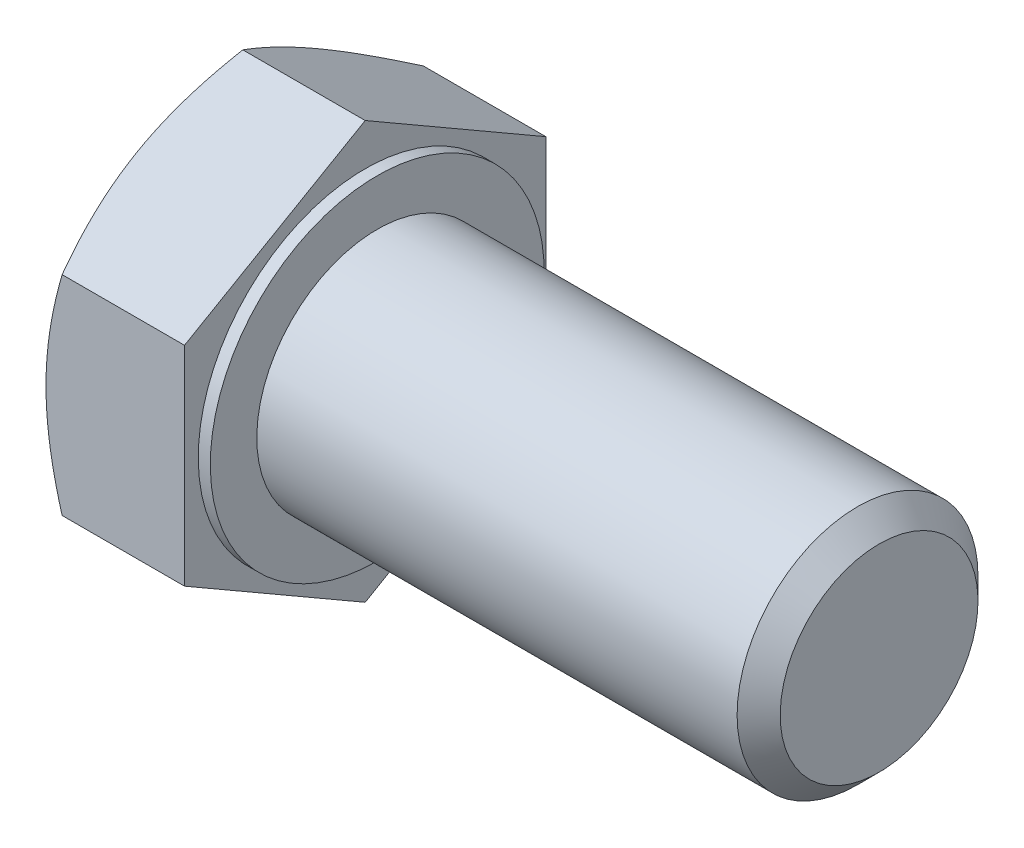
ISO-10303-21;
HEADER;
FILE_DESCRIPTION(('STEP AP214'),'2;1');
FILE_NAME('part.step','',(''),(''),'','','');
FILE_SCHEMA(('AUTOMOTIVE_DESIGN { 1 0 10303 214 1 1 1 1 }'));
ENDSEC;
DATA;
#1=APPLICATION_CONTEXT('core data for automotive mechanical design processes');
#2=APPLICATION_PROTOCOL_DEFINITION('international standard','automotive_design',2000,#1);
#3=PRODUCT_CONTEXT('',#1,'mechanical');
#4=PRODUCT('Part','Part','',(#3));
#5=PRODUCT_RELATED_PRODUCT_CATEGORY('part','',(#4));
#6=PRODUCT_DEFINITION_FORMATION('','',#4);
#7=PRODUCT_DEFINITION_CONTEXT('part definition',#1,'design');
#8=PRODUCT_DEFINITION('design','',#6,#7);
#9=PRODUCT_DEFINITION_SHAPE('','',#8);
#10=(LENGTH_UNIT() NAMED_UNIT(*) SI_UNIT(.MILLI.,.METRE.));
#11=(NAMED_UNIT(*) PLANE_ANGLE_UNIT() SI_UNIT($,.RADIAN.));
#12=(NAMED_UNIT(*) SI_UNIT($,.STERADIAN.) SOLID_ANGLE_UNIT());
#13=UNCERTAINTY_MEASURE_WITH_UNIT(LENGTH_MEASURE(1.E-05),#10,'distance_accuracy_value','');
#14=(GEOMETRIC_REPRESENTATION_CONTEXT(3) GLOBAL_UNCERTAINTY_ASSIGNED_CONTEXT((#13)) GLOBAL_UNIT_ASSIGNED_CONTEXT((#10,
#11,#12)) REPRESENTATION_CONTEXT('',''));
#15=CARTESIAN_POINT('',(0.,0.,0.));
#16=DIRECTION('',(0.,0.,1.));
#17=DIRECTION('',(1.,0.,0.));
#18=AXIS2_PLACEMENT_3D('',#15,#16,#17);
#19=CARTESIAN_POINT('',(0.,7.1575,0.));
#20=DIRECTION('',(1.,0.,0.));
#21=DIRECTION('',(0.,1.,0.));
#22=AXIS2_PLACEMENT_3D('',#19,#20,#21);
#23=PLANE('',#22);
#24=CARTESIAN_POINT('',(0.,0.,0.));
#25=DIRECTION('',(1.,0.,0.));
#26=DIRECTION('',(0.,1.,0.));
#27=AXIS2_PLACEMENT_3D('',#24,#25,#26);
#28=CIRCLE('',#27,6.);
#29=CARTESIAN_POINT('',(0.,-6.,0.));
#30=VERTEX_POINT('',#29);
#31=EDGE_CURVE('E147',#30,#30,#28,.T.);
#32=ORIENTED_EDGE('',*,*,#31,.F.);
#33=EDGE_LOOP('',(#32));
#34=FACE_BOUND('',#33,.T.);
#35=CARTESIAN_POINT('',(0.,0.,0.));
#36=DIRECTION('',(1.,0.,0.));
#37=DIRECTION('',(0.,1.,0.));
#38=AXIS2_PLACEMENT_3D('',#35,#36,#37);
#39=CIRCLE('',#38,8.315);
#40=CARTESIAN_POINT('',(0.,-8.315,0.));
#41=VERTEX_POINT('',#40);
#42=EDGE_CURVE('E30',#41,#41,#39,.T.);
#43=ORIENTED_EDGE('',*,*,#42,.T.);
#44=EDGE_LOOP('',(#43));
#45=FACE_BOUND('',#44,.T.);
#46=ADVANCED_FACE('F17',(#34,#45),#23,.T.);
#47=CARTESIAN_POINT('',(-0.300049999999996,0.,0.));
#48=DIRECTION('',(1.,0.,0.));
#49=DIRECTION('',(0.,1.,0.));
#50=AXIS2_PLACEMENT_3D('',#47,#48,#49);
#51=CYLINDRICAL_SURFACE('',#50,8.315);
#52=ORIENTED_EDGE('',*,*,#42,.F.);
#53=DIRECTION('',(-1.,0.,0.));
#54=VECTOR('',#53,1.);
#55=CARTESIAN_POINT('',(-0.300049999999996,-8.315,0.));
#56=LINE('',#55,#54);
#57=CARTESIAN_POINT('',(-0.6001,-8.315,0.));
#58=VERTEX_POINT('',#57);
#59=EDGE_CURVE('E11',#41,#58,#56,.T.);
#60=ORIENTED_EDGE('',*,*,#59,.T.);
#61=CARTESIAN_POINT('',(-0.6001,0.,0.));
#62=DIRECTION('',(1.,0.,0.));
#63=DIRECTION('',(0.,1.,0.));
#64=AXIS2_PLACEMENT_3D('',#61,#62,#63);
#65=CIRCLE('',#64,8.315);
#66=EDGE_CURVE('E227',#58,#58,#65,.T.);
#67=ORIENTED_EDGE('',*,*,#66,.T.);
#68=ORIENTED_EDGE('',*,*,#59,.F.);
#69=EDGE_LOOP('',(#52,#60,#67,#68));
#70=FACE_BOUND('',#69,.T.);
#71=ADVANCED_FACE('F427',(#70),#51,.T.);
#72=CARTESIAN_POINT('',(-7.5001,0.,0.));
#73=DIRECTION('',(1.,0.,0.));
#74=DIRECTION('',(0.,1.,0.));
#75=AXIS2_PLACEMENT_3D('',#72,#73,#74);
#76=PLANE('',#75);
#77=CARTESIAN_POINT('',(-7.5001,0.,0.));
#78=DIRECTION('',(-1.,0.,0.));
#79=DIRECTION('',(0.,1.,0.));
#80=AXIS2_PLACEMENT_3D('',#77,#78,#79);
#81=CIRCLE('',#80,9.);
#82=CARTESIAN_POINT('',(-7.5001,0.,9.));
#83=VERTEX_POINT('',#82);
#84=CARTESIAN_POINT('',(-7.5001,7.79422863405994,4.5));
#85=VERTEX_POINT('',#84);
#86=EDGE_CURVE('E161',#83,#85,#81,.T.);
#87=ORIENTED_EDGE('',*,*,#86,.T.);
#88=CARTESIAN_POINT('',(-7.5001,0.,0.));
#89=DIRECTION('',(-1.,0.,0.));
#90=DIRECTION('',(0.,1.,0.));
#91=AXIS2_PLACEMENT_3D('',#88,#89,#90);
#92=CIRCLE('',#91,9.);
#93=CARTESIAN_POINT('',(-7.5001,7.79422863405994,-4.5));
#94=VERTEX_POINT('',#93);
#95=EDGE_CURVE('E184',#85,#94,#92,.T.);
#96=ORIENTED_EDGE('',*,*,#95,.T.);
#97=CARTESIAN_POINT('',(-7.5001,0.,0.));
#98=DIRECTION('',(-1.,0.,0.));
#99=DIRECTION('',(0.,1.,0.));
#100=AXIS2_PLACEMENT_3D('',#97,#98,#99);
#101=CIRCLE('',#100,9.);
#102=CARTESIAN_POINT('',(-7.5001,0.,-9.));
#103=VERTEX_POINT('',#102);
#104=EDGE_CURVE('E274',#94,#103,#101,.T.);
#105=ORIENTED_EDGE('',*,*,#104,.T.);
#106=CARTESIAN_POINT('',(-7.5001,0.,0.));
#107=DIRECTION('',(-1.,0.,0.));
#108=DIRECTION('',(0.,1.,0.));
#109=AXIS2_PLACEMENT_3D('',#106,#107,#108);
#110=CIRCLE('',#109,9.);
#111=CARTESIAN_POINT('',(-7.5001,-7.79422863405994,-4.5));
#112=VERTEX_POINT('',#111);
#113=EDGE_CURVE('E166',#103,#112,#110,.T.);
#114=ORIENTED_EDGE('',*,*,#113,.T.);
#115=CARTESIAN_POINT('',(-7.5001,0.,0.));
#116=DIRECTION('',(-1.,0.,0.));
#117=DIRECTION('',(0.,1.,0.));
#118=AXIS2_PLACEMENT_3D('',#115,#116,#117);
#119=CIRCLE('',#118,9.);
#120=CARTESIAN_POINT('',(-7.5001,-7.79422863405994,4.5));
#121=VERTEX_POINT('',#120);
#122=EDGE_CURVE('E168',#112,#121,#119,.T.);
#123=ORIENTED_EDGE('',*,*,#122,.T.);
#124=CARTESIAN_POINT('',(-7.5001,0.,0.));
#125=DIRECTION('',(-1.,0.,0.));
#126=DIRECTION('',(0.,1.,0.));
#127=AXIS2_PLACEMENT_3D('',#124,#125,#126);
#128=CIRCLE('',#127,9.);
#129=EDGE_CURVE('E185',#121,#83,#128,.T.);
#130=ORIENTED_EDGE('',*,*,#129,.T.);
#131=EDGE_LOOP('',(#87,#96,#105,#114,#123,#130));
#132=FACE_BOUND('',#131,.T.);
#133=ADVANCED_FACE('F319',(#132),#76,.F.);
#134=CARTESIAN_POINT('',(-0.600099999999993,-10.3923048454133,0.));
#135=DIRECTION('',(0.,-0.866025403784438,-0.5));
#136=DIRECTION('',(0.,0.5,-0.866025403784438));
#137=AXIS2_PLACEMENT_3D('',#134,#135,#136);
#138=PLANE('',#137);
#139=CARTESIAN_POINT('',(-7.5001,-7.79422863405994,-4.5));
#140=CARTESIAN_POINT('',(-7.50010000000001,-6.58845726811989,-6.58845726811988));
#141=CARTESIAN_POINT('',(-6.69625242270666,-5.19615242270663,-9.));
#142=(BOUNDED_CURVE() B_SPLINE_CURVE(2,(#139,#140,#141),.UNSPECIFIED.,.F.,
.F.) B_SPLINE_CURVE_WITH_KNOTS((3,3),(0.527138746897715,1.05427749379543),
.UNSPECIFIED.) CURVE() GEOMETRIC_REPRESENTATION_ITEM() RATIONAL_B_SPLINE_CURVE((1.,
1.03795484930204,1.)) REPRESENTATION_ITEM(''));
#143=CARTESIAN_POINT('',(-6.69625242270666,-5.19615242270664,-9.));
#144=VERTEX_POINT('',#143);
#145=EDGE_CURVE('E202',#112,#144,#142,.T.);
#146=ORIENTED_EDGE('',*,*,#145,.T.);
#147=DIRECTION('',(-1.,0.,0.));
#148=VECTOR('',#147,1.);
#149=CARTESIAN_POINT('',(-0.600099999999993,-5.19615242270662,-9.));
#150=LINE('',#149,#148);
#151=CARTESIAN_POINT('',(-0.600099999999993,-5.19615242270662,-9.));
#152=VERTEX_POINT('',#151);
#153=EDGE_CURVE('E173',#152,#144,#150,.T.);
#154=ORIENTED_EDGE('',*,*,#153,.F.);
#155=DIRECTION('',(0.,0.5,-0.866025403784438));
#156=VECTOR('',#155,1.);
#157=CARTESIAN_POINT('',(-0.600099999999993,-10.3923048454133,0.));
#158=LINE('',#157,#156);
#159=CARTESIAN_POINT('',(-0.600099999999993,-10.3923048454133,0.));
#160=VERTEX_POINT('',#159);
#161=EDGE_CURVE('E138',#160,#152,#158,.T.);
#162=ORIENTED_EDGE('',*,*,#161,.F.);
#163=DIRECTION('',(-1.,0.,0.));
#164=VECTOR('',#163,1.);
#165=CARTESIAN_POINT('',(-0.600099999999993,-10.3923048454133,0.));
#166=LINE('',#165,#164);
#167=CARTESIAN_POINT('',(-6.69625242270666,-10.3923048454132,0.));
#168=VERTEX_POINT('',#167);
#169=EDGE_CURVE('E226',#160,#168,#166,.T.);
#170=ORIENTED_EDGE('',*,*,#169,.T.);
#171=CARTESIAN_POINT('',(-6.69625242270666,-10.3923048454132,0.));
#172=CARTESIAN_POINT('',(-7.50010000000001,-8.99999999999998,-2.41154273188012));
#173=CARTESIAN_POINT('',(-7.5001,-7.79422863405994,-4.5));
#174=(BOUNDED_CURVE() B_SPLINE_CURVE(2,(#171,#172,#173),.UNSPECIFIED.,.F.,
.F.) B_SPLINE_CURVE_WITH_KNOTS((3,3),(0.,0.527138746897715),
.UNSPECIFIED.) CURVE() GEOMETRIC_REPRESENTATION_ITEM() RATIONAL_B_SPLINE_CURVE((1.,
1.03795484930204,1.)) REPRESENTATION_ITEM(''));
#175=EDGE_CURVE('E194',#168,#112,#174,.T.);
#176=ORIENTED_EDGE('',*,*,#175,.T.);
#177=EDGE_LOOP('',(#146,#154,#162,#170,#176));
#178=FACE_BOUND('',#177,.T.);
#179=ADVANCED_FACE('F373',(#178),#138,.T.);
#180=CARTESIAN_POINT('',(-0.600099999999993,-5.19615242270663,9.));
#181=DIRECTION('',(0.,-0.866025403784439,0.5));
#182=DIRECTION('',(-1.,0.,0.));
#183=AXIS2_PLACEMENT_3D('',#180,#181,#182);
#184=PLANE('',#183);
#185=CARTESIAN_POINT('',(-7.5001,-7.79422863405994,4.5));
#186=CARTESIAN_POINT('',(-7.50010000000002,-8.99999999999999,2.4115427318801));
#187=CARTESIAN_POINT('',(-6.69625242270666,-10.3923048454132,0.));
#188=(BOUNDED_CURVE() B_SPLINE_CURVE(2,(#185,#186,#187),.UNSPECIFIED.,.F.,
.F.) B_SPLINE_CURVE_WITH_KNOTS((3,3),(0.527138746897716,1.05427749379543),
.UNSPECIFIED.) CURVE() GEOMETRIC_REPRESENTATION_ITEM() RATIONAL_B_SPLINE_CURVE((1.,
1.03795484930203,1.)) REPRESENTATION_ITEM(''));
#189=EDGE_CURVE('E172',#121,#168,#188,.T.);
#190=ORIENTED_EDGE('',*,*,#189,.T.);
#191=ORIENTED_EDGE('',*,*,#169,.F.);
#192=DIRECTION('',(0.,-0.5,-0.866025403784439));
#193=VECTOR('',#192,1.);
#194=CARTESIAN_POINT('',(-0.600099999999993,-5.19615242270663,9.));
#195=LINE('',#194,#193);
#196=CARTESIAN_POINT('',(-0.600099999999993,-5.19615242270663,9.));
#197=VERTEX_POINT('',#196);
#198=EDGE_CURVE('E287',#197,#160,#195,.T.);
#199=ORIENTED_EDGE('',*,*,#198,.F.);
#200=DIRECTION('',(-1.,0.,0.));
#201=VECTOR('',#200,1.);
#202=CARTESIAN_POINT('',(-0.600099999999993,-5.19615242270663,9.));
#203=LINE('',#202,#201);
#204=CARTESIAN_POINT('',(-6.69625242270666,-5.1961524227066,9.));
#205=VERTEX_POINT('',#204);
#206=EDGE_CURVE('E223',#197,#205,#203,.T.);
#207=ORIENTED_EDGE('',*,*,#206,.T.);
#208=CARTESIAN_POINT('',(-6.69625242270666,-5.19615242270665,9.));
#209=CARTESIAN_POINT('',(-7.50010000000001,-6.5884572681199,6.58845726811989));
#210=CARTESIAN_POINT('',(-7.5001,-7.79422863405994,4.5));
#211=(BOUNDED_CURVE() B_SPLINE_CURVE(2,(#208,#209,#210),.UNSPECIFIED.,.F.,
.F.) B_SPLINE_CURVE_WITH_KNOTS((3,3),(0.,0.527138746897716),
.UNSPECIFIED.) CURVE() GEOMETRIC_REPRESENTATION_ITEM() RATIONAL_B_SPLINE_CURVE((1.,
1.03795484930204,1.)) REPRESENTATION_ITEM(''));
#212=EDGE_CURVE('E246',#205,#121,#211,.T.);
#213=ORIENTED_EDGE('',*,*,#212,.T.);
#214=EDGE_LOOP('',(#190,#191,#199,#207,#213));
#215=FACE_BOUND('',#214,.T.);
#216=ADVANCED_FACE('F379',(#215),#184,.T.);
#217=CARTESIAN_POINT('',(-0.6001,5.19615242270662,9.));
#218=DIRECTION('',(0.,0.,1.));
#219=DIRECTION('',(1.,0.,0.));
#220=AXIS2_PLACEMENT_3D('',#217,#218,#219);
#221=PLANE('',#220);
#222=CARTESIAN_POINT('',(-7.5001,0.,9.));
#223=CARTESIAN_POINT('',(-7.50010000000003,-2.41154273188009,8.99999999999999));
#224=CARTESIAN_POINT('',(-6.69625242270666,-5.19615242270661,9.));
#225=(BOUNDED_CURVE() B_SPLINE_CURVE(2,(#222,#223,#224),.UNSPECIFIED.,.F.,
.F.) B_SPLINE_CURVE_WITH_KNOTS((3,3),(0.527138746897716,1.05427749379543),
.UNSPECIFIED.) CURVE() GEOMETRIC_REPRESENTATION_ITEM() RATIONAL_B_SPLINE_CURVE((1.,
1.03795484930205,1.)) REPRESENTATION_ITEM(''));
#226=EDGE_CURVE('E252',#83,#205,#225,.T.);
#227=ORIENTED_EDGE('',*,*,#226,.T.);
#228=ORIENTED_EDGE('',*,*,#206,.F.);
#229=DIRECTION('',(0.,-1.,0.));
#230=VECTOR('',#229,1.);
#231=CARTESIAN_POINT('',(-0.6001,5.19615242270662,9.));
#232=LINE('',#231,#230);
#233=CARTESIAN_POINT('',(-0.6001,5.19615242270662,9.));
#234=VERTEX_POINT('',#233);
#235=EDGE_CURVE('E219',#234,#197,#232,.T.);
#236=ORIENTED_EDGE('',*,*,#235,.F.);
#237=DIRECTION('',(-1.,0.,0.));
#238=VECTOR('',#237,1.);
#239=CARTESIAN_POINT('',(-0.6001,5.19615242270662,9.));
#240=LINE('',#239,#238);
#241=CARTESIAN_POINT('',(-6.69625242270666,5.19615242270659,9.));
#242=VERTEX_POINT('',#241);
#243=EDGE_CURVE('E201',#234,#242,#240,.T.);
#244=ORIENTED_EDGE('',*,*,#243,.T.);
#245=CARTESIAN_POINT('',(-6.69625242270666,5.1961524227066,9.));
#246=CARTESIAN_POINT('',(-7.50010000000001,2.41154273188008,9.));
#247=CARTESIAN_POINT('',(-7.5001,0.,9.));
#248=(BOUNDED_CURVE() B_SPLINE_CURVE(2,(#245,#246,#247),.UNSPECIFIED.,.F.,
.F.) B_SPLINE_CURVE_WITH_KNOTS((3,3),(0.,0.527138746897716),
.UNSPECIFIED.) CURVE() GEOMETRIC_REPRESENTATION_ITEM() RATIONAL_B_SPLINE_CURVE((1.,
1.03795484930204,1.)) REPRESENTATION_ITEM(''));
#249=EDGE_CURVE('E253',#242,#83,#248,.T.);
#250=ORIENTED_EDGE('',*,*,#249,.T.);
#251=EDGE_LOOP('',(#227,#228,#236,#244,#250));
#252=FACE_BOUND('',#251,.T.);
#253=ADVANCED_FACE('F453',(#252),#221,.T.);
#254=CARTESIAN_POINT('',(-0.6001,0.,0.));
#255=DIRECTION('',(1.,0.,0.));
#256=DIRECTION('',(0.,1.,0.));
#257=AXIS2_PLACEMENT_3D('',#254,#255,#256);
#258=PLANE('',#257);
#259=ORIENTED_EDGE('',*,*,#66,.F.);
#260=EDGE_LOOP('',(#259));
#261=FACE_BOUND('',#260,.T.);
#262=DIRECTION('',(0.,-0.5,0.866025403784438));
#263=VECTOR('',#262,1.);
#264=CARTESIAN_POINT('',(-0.6001,10.3923048454133,0.));
#265=LINE('',#264,#263);
#266=CARTESIAN_POINT('',(-0.6001,10.3923048454133,0.));
#267=VERTEX_POINT('',#266);
#268=EDGE_CURVE('E127',#267,#234,#265,.T.);
#269=ORIENTED_EDGE('',*,*,#268,.T.);
#270=ORIENTED_EDGE('',*,*,#235,.T.);
#271=ORIENTED_EDGE('',*,*,#198,.T.);
#272=ORIENTED_EDGE('',*,*,#161,.T.);
#273=DIRECTION('',(0.,1.,0.));
#274=VECTOR('',#273,1.);
#275=CARTESIAN_POINT('',(-0.600099999999993,-5.19615242270662,-9.));
#276=LINE('',#275,#274);
#277=CARTESIAN_POINT('',(-0.6001,5.19615242270663,-9.));
#278=VERTEX_POINT('',#277);
#279=EDGE_CURVE('E177',#152,#278,#276,.T.);
#280=ORIENTED_EDGE('',*,*,#279,.T.);
#281=DIRECTION('',(0.,0.5,0.866025403784439));
#282=VECTOR('',#281,1.);
#283=CARTESIAN_POINT('',(-0.6001,5.19615242270663,-9.));
#284=LINE('',#283,#282);
#285=EDGE_CURVE('E195',#278,#267,#284,.T.);
#286=ORIENTED_EDGE('',*,*,#285,.T.);
#287=EDGE_LOOP('',(#269,#270,#271,#272,#280,#286));
#288=FACE_BOUND('',#287,.T.);
#289=ADVANCED_FACE('F447',(#261,#288),#258,.T.);
#290=CARTESIAN_POINT('',(-0.6001,10.3923048454133,0.));
#291=DIRECTION('',(0.,0.866025403784438,0.5));
#292=DIRECTION('',(1.,0.,0.));
#293=AXIS2_PLACEMENT_3D('',#290,#291,#292);
#294=PLANE('',#293);
#295=CARTESIAN_POINT('',(-6.69625242270666,10.3923048454132,0.));
#296=CARTESIAN_POINT('',(-7.50010000000002,8.99999999999999,2.41154273188012));
#297=CARTESIAN_POINT('',(-7.5001,7.79422863405994,4.5));
#298=(BOUNDED_CURVE() B_SPLINE_CURVE(2,(#295,#296,#297),.UNSPECIFIED.,.F.,
.F.) B_SPLINE_CURVE_WITH_KNOTS((3,3),(0.,0.527138746897715),
.UNSPECIFIED.) CURVE() GEOMETRIC_REPRESENTATION_ITEM() RATIONAL_B_SPLINE_CURVE((1.,
1.03795484930205,1.)) REPRESENTATION_ITEM(''));
#299=CARTESIAN_POINT('',(-6.69625242270666,10.3923048454132,0.));
#300=VERTEX_POINT('',#299);
#301=EDGE_CURVE('E228',#300,#85,#298,.T.);
#302=ORIENTED_EDGE('',*,*,#301,.T.);
#303=CARTESIAN_POINT('',(-7.5001,7.79422863405994,4.5));
#304=CARTESIAN_POINT('',(-7.50010000000001,6.58845726811989,6.58845726811989));
#305=CARTESIAN_POINT('',(-6.69625242270666,5.19615242270664,9.));
#306=(BOUNDED_CURVE() B_SPLINE_CURVE(2,(#303,#304,#305),.UNSPECIFIED.,.F.,
.F.) B_SPLINE_CURVE_WITH_KNOTS((3,3),(0.527138746897715,1.05427749379543),
.UNSPECIFIED.) CURVE() GEOMETRIC_REPRESENTATION_ITEM() RATIONAL_B_SPLINE_CURVE((1.,
1.03795484930204,1.)) REPRESENTATION_ITEM(''));
#307=EDGE_CURVE('E21',#85,#242,#306,.T.);
#308=ORIENTED_EDGE('',*,*,#307,.T.);
#309=ORIENTED_EDGE('',*,*,#243,.F.);
#310=ORIENTED_EDGE('',*,*,#268,.F.);
#311=DIRECTION('',(-1.,0.,0.));
#312=VECTOR('',#311,1.);
#313=CARTESIAN_POINT('',(-0.6001,10.3923048454133,0.));
#314=LINE('',#313,#312);
#315=EDGE_CURVE('E176',#267,#300,#314,.T.);
#316=ORIENTED_EDGE('',*,*,#315,.T.);
#317=EDGE_LOOP('',(#302,#308,#309,#310,#316));
#318=FACE_BOUND('',#317,.T.);
#319=ADVANCED_FACE('F452',(#318),#294,.T.);
#320=CARTESIAN_POINT('',(-0.6001,5.19615242270663,-9.));
#321=DIRECTION('',(0.,0.866025403784439,-0.5));
#322=DIRECTION('',(-1.,0.,0.));
#323=AXIS2_PLACEMENT_3D('',#320,#321,#322);
#324=PLANE('',#323);
#325=CARTESIAN_POINT('',(-6.69625242270666,5.19615242270664,-9.));
#326=CARTESIAN_POINT('',(-7.50010000000001,6.58845726811989,-6.58845726811988));
#327=CARTESIAN_POINT('',(-7.5001,7.79422863405994,-4.5));
#328=(BOUNDED_CURVE() B_SPLINE_CURVE(2,(#325,#326,#327),.UNSPECIFIED.,.F.,
.F.) B_SPLINE_CURVE_WITH_KNOTS((3,3),(0.,0.527138746897716),
.UNSPECIFIED.) CURVE() GEOMETRIC_REPRESENTATION_ITEM() RATIONAL_B_SPLINE_CURVE((1.,
1.03795484930204,1.)) REPRESENTATION_ITEM(''));
#329=CARTESIAN_POINT('',(-6.69625242270666,5.1961524227066,-9.));
#330=VERTEX_POINT('',#329);
#331=EDGE_CURVE('E282',#330,#94,#328,.T.);
#332=ORIENTED_EDGE('',*,*,#331,.T.);
#333=CARTESIAN_POINT('',(-7.5001,7.79422863405994,-4.5));
#334=CARTESIAN_POINT('',(-7.50010000000002,8.99999999999999,-2.4115427318801));
#335=CARTESIAN_POINT('',(-6.69625242270666,10.3923048454132,0.));
#336=(BOUNDED_CURVE() B_SPLINE_CURVE(2,(#333,#334,#335),.UNSPECIFIED.,.F.,
.F.) B_SPLINE_CURVE_WITH_KNOTS((3,3),(0.527138746897716,1.05427749379543),
.UNSPECIFIED.) CURVE() GEOMETRIC_REPRESENTATION_ITEM() RATIONAL_B_SPLINE_CURVE((1.,
1.03795484930204,1.)) REPRESENTATION_ITEM(''));
#337=EDGE_CURVE('E178',#94,#300,#336,.T.);
#338=ORIENTED_EDGE('',*,*,#337,.T.);
#339=ORIENTED_EDGE('',*,*,#315,.F.);
#340=ORIENTED_EDGE('',*,*,#285,.F.);
#341=DIRECTION('',(-1.,0.,0.));
#342=VECTOR('',#341,1.);
#343=CARTESIAN_POINT('',(-0.6001,5.19615242270663,-9.));
#344=LINE('',#343,#342);
#345=EDGE_CURVE('E222',#278,#330,#344,.T.);
#346=ORIENTED_EDGE('',*,*,#345,.T.);
#347=EDGE_LOOP('',(#332,#338,#339,#340,#346));
#348=FACE_BOUND('',#347,.T.);
#349=ADVANCED_FACE('F485',(#348),#324,.T.);
#350=CARTESIAN_POINT('',(-0.600099999999993,-5.19615242270662,-9.));
#351=DIRECTION('',(0.,0.,-1.));
#352=DIRECTION('',(0.,-1.,0.));
#353=AXIS2_PLACEMENT_3D('',#350,#351,#352);
#354=PLANE('',#353);
#355=CARTESIAN_POINT('',(-6.69625242270666,-5.1961524227066,-9.));
#356=CARTESIAN_POINT('',(-7.50010000000002,-2.41154273188008,-9.));
#357=CARTESIAN_POINT('',(-7.5001,0.,-9.));
#358=(BOUNDED_CURVE() B_SPLINE_CURVE(2,(#355,#356,#357),.UNSPECIFIED.,.F.,
.F.) B_SPLINE_CURVE_WITH_KNOTS((3,3),(0.,0.527138746897715),
.UNSPECIFIED.) CURVE() GEOMETRIC_REPRESENTATION_ITEM() RATIONAL_B_SPLINE_CURVE((1.,
1.03795484930202,1.)) REPRESENTATION_ITEM(''));
#359=EDGE_CURVE('E208',#144,#103,#358,.T.);
#360=ORIENTED_EDGE('',*,*,#359,.T.);
#361=CARTESIAN_POINT('',(-7.5001,0.,-9.));
#362=CARTESIAN_POINT('',(-7.50010000000002,2.41154273188008,-8.99999999999999));
#363=CARTESIAN_POINT('',(-6.69625242270666,5.1961524227066,-9.));
#364=(BOUNDED_CURVE() B_SPLINE_CURVE(2,(#361,#362,#363),.UNSPECIFIED.,.F.,
.F.) B_SPLINE_CURVE_WITH_KNOTS((3,3),(0.527138746897715,1.05427749379543),
.UNSPECIFIED.) CURVE() GEOMETRIC_REPRESENTATION_ITEM() RATIONAL_B_SPLINE_CURVE((1.,
1.03795484930203,1.)) REPRESENTATION_ITEM(''));
#365=EDGE_CURVE('E171',#103,#330,#364,.T.);
#366=ORIENTED_EDGE('',*,*,#365,.T.);
#367=ORIENTED_EDGE('',*,*,#345,.F.);
#368=ORIENTED_EDGE('',*,*,#279,.F.);
#369=ORIENTED_EDGE('',*,*,#153,.T.);
#370=EDGE_LOOP('',(#360,#366,#367,#368,#369));
#371=FACE_BOUND('',#370,.T.);
#372=ADVANCED_FACE('F328',(#371),#354,.T.);
#373=CARTESIAN_POINT('',(-7.09817621135334,0.,0.));
#374=DIRECTION('',(1.,0.,0.));
#375=DIRECTION('',(0.,1.,0.));
#376=AXIS2_PLACEMENT_3D('',#373,#374,#375);
#377=CONICAL_SURFACE('',#376,9.69615242270662,1.0471975511966);
#378=ORIENTED_EDGE('',*,*,#359,.F.);
#379=ORIENTED_EDGE('',*,*,#145,.F.);
#380=ORIENTED_EDGE('',*,*,#113,.F.);
#381=EDGE_LOOP('',(#378,#379,#380));
#382=FACE_BOUND('',#381,.T.);
#383=ADVANCED_FACE('F19',(#382),#377,.T.);
#384=CARTESIAN_POINT('',(-7.09817621135334,0.,0.));
#385=DIRECTION('',(1.,0.,0.));
#386=DIRECTION('',(0.,1.,0.));
#387=AXIS2_PLACEMENT_3D('',#384,#385,#386);
#388=CONICAL_SURFACE('',#387,9.69615242270662,1.0471975511966);
#389=ORIENTED_EDGE('',*,*,#365,.F.);
#390=ORIENTED_EDGE('',*,*,#104,.F.);
#391=ORIENTED_EDGE('',*,*,#331,.F.);
#392=EDGE_LOOP('',(#389,#390,#391));
#393=FACE_BOUND('',#392,.T.);
#394=ADVANCED_FACE('F325',(#393),#388,.T.);
#395=CARTESIAN_POINT('',(-7.09817621135334,0.,0.));
#396=DIRECTION('',(1.,0.,0.));
#397=DIRECTION('',(0.,-1.,0.));
#398=AXIS2_PLACEMENT_3D('',#395,#396,#397);
#399=CONICAL_SURFACE('',#398,9.69615242270662,1.0471975511966);
#400=ORIENTED_EDGE('',*,*,#175,.F.);
#401=ORIENTED_EDGE('',*,*,#189,.F.);
#402=ORIENTED_EDGE('',*,*,#122,.F.);
#403=EDGE_LOOP('',(#400,#401,#402));
#404=FACE_BOUND('',#403,.T.);
#405=ADVANCED_FACE('F439',(#404),#399,.T.);
#406=CARTESIAN_POINT('',(-7.09817621135334,0.,0.));
#407=DIRECTION('',(1.,0.,0.));
#408=DIRECTION('',(0.,1.,0.));
#409=AXIS2_PLACEMENT_3D('',#406,#407,#408);
#410=CONICAL_SURFACE('',#409,9.69615242270662,1.0471975511966);
#411=ORIENTED_EDGE('',*,*,#337,.F.);
#412=ORIENTED_EDGE('',*,*,#95,.F.);
#413=ORIENTED_EDGE('',*,*,#301,.F.);
#414=EDGE_LOOP('',(#411,#412,#413));
#415=FACE_BOUND('',#414,.T.);
#416=ADVANCED_FACE('F434',(#415),#410,.T.);
#417=CARTESIAN_POINT('',(-7.09817621135334,0.,0.));
#418=DIRECTION('',(1.,0.,0.));
#419=DIRECTION('',(0.,1.,0.));
#420=AXIS2_PLACEMENT_3D('',#417,#418,#419);
#421=CONICAL_SURFACE('',#420,9.69615242270662,1.0471975511966);
#422=ORIENTED_EDGE('',*,*,#212,.F.);
#423=ORIENTED_EDGE('',*,*,#226,.F.);
#424=ORIENTED_EDGE('',*,*,#129,.F.);
#425=EDGE_LOOP('',(#422,#423,#424));
#426=FACE_BOUND('',#425,.T.);
#427=ADVANCED_FACE('F395',(#426),#421,.T.);
#428=CARTESIAN_POINT('',(-7.09817621135334,0.,0.));
#429=DIRECTION('',(1.,0.,0.));
#430=DIRECTION('',(0.,1.,0.));
#431=AXIS2_PLACEMENT_3D('',#428,#429,#430);
#432=CONICAL_SURFACE('',#431,9.69615242270662,1.0471975511966);
#433=ORIENTED_EDGE('',*,*,#307,.F.);
#434=ORIENTED_EDGE('',*,*,#86,.F.);
#435=ORIENTED_EDGE('',*,*,#249,.F.);
#436=EDGE_LOOP('',(#433,#434,#435));
#437=FACE_BOUND('',#436,.T.);
#438=ADVANCED_FACE('F389',(#437),#432,.T.);
#439=CARTESIAN_POINT('',(25.,3.,0.));
#440=DIRECTION('',(1.,0.,0.));
#441=DIRECTION('',(0.,1.,0.));
#442=AXIS2_PLACEMENT_3D('',#439,#440,#441);
#443=PLANE('',#442);
#444=CARTESIAN_POINT('',(25.,0.,0.));
#445=DIRECTION('',(-1.,0.,0.));
#446=DIRECTION('',(0.,-1.,0.));
#447=AXIS2_PLACEMENT_3D('',#444,#445,#446);
#448=CIRCLE('',#447,4.9264625);
#449=CARTESIAN_POINT('',(25.,4.9264625,0.));
#450=VERTEX_POINT('',#449);
#451=EDGE_CURVE('E162',#450,#450,#448,.T.);
#452=ORIENTED_EDGE('',*,*,#451,.F.);
#453=EDGE_LOOP('',(#452));
#454=FACE_BOUND('',#453,.T.);
#455=ADVANCED_FACE('F394',(#454),#443,.T.);
#456=CARTESIAN_POINT('',(15.15,0.,0.));
#457=DIRECTION('',(1.,0.,0.));
#458=DIRECTION('',(0.,1.,0.));
#459=AXIS2_PLACEMENT_3D('',#456,#457,#458);
#460=CYLINDRICAL_SURFACE('',#459,6.);
#461=CARTESIAN_POINT('',(23.9263625,0.,0.));
#462=DIRECTION('',(1.,0.,0.));
#463=DIRECTION('',(0.,-1.,0.));
#464=AXIS2_PLACEMENT_3D('',#461,#462,#463);
#465=CIRCLE('',#464,6.);
#466=CARTESIAN_POINT('',(23.9263625,6.,0.));
#467=VERTEX_POINT('',#466);
#468=CARTESIAN_POINT('',(23.9263625,-6.,0.));
#469=VERTEX_POINT('',#468);
#470=EDGE_CURVE('E238',#467,#469,#465,.T.);
#471=ORIENTED_EDGE('',*,*,#470,.F.);
#472=CARTESIAN_POINT('',(23.9263625,0.,0.));
#473=DIRECTION('',(1.,0.,0.));
#474=DIRECTION('',(0.,-1.,0.));
#475=AXIS2_PLACEMENT_3D('',#472,#473,#474);
#476=CIRCLE('',#475,6.);
#477=EDGE_CURVE('E215',#469,#467,#476,.T.);
#478=ORIENTED_EDGE('',*,*,#477,.F.);
#479=DIRECTION('',(-1.,0.,0.));
#480=VECTOR('',#479,1.);
#481=CARTESIAN_POINT('',(15.15,-6.,0.));
#482=LINE('',#481,#480);
#483=EDGE_CURVE('E150',#469,#30,#482,.T.);
#484=ORIENTED_EDGE('',*,*,#483,.T.);
#485=ORIENTED_EDGE('',*,*,#31,.T.);
#486=ORIENTED_EDGE('',*,*,#483,.F.);
#487=EDGE_LOOP('',(#471,#478,#484,#485,#486));
#488=FACE_BOUND('',#487,.T.);
#489=ADVANCED_FACE('F149',(#488),#460,.T.);
#490=CARTESIAN_POINT('',(24.46318125,0.,0.));
#491=DIRECTION('',(-1.,0.,0.));
#492=DIRECTION('',(0.,-1.,0.));
#493=AXIS2_PLACEMENT_3D('',#490,#491,#492);
#494=CONICAL_SURFACE('',#493,5.46323125,0.785351590575051);
#495=ORIENTED_EDGE('',*,*,#470,.T.);
#496=ORIENTED_EDGE('',*,*,#477,.T.);
#497=DIRECTION('',(0.707139712378204,-0.707073848461157,0.));
#498=VECTOR('',#497,1.);
#499=CARTESIAN_POINT('',(24.46318125,5.46323125,0.));
#500=LINE('',#499,#498);
#501=EDGE_CURVE('E209',#467,#450,#500,.T.);
#502=ORIENTED_EDGE('',*,*,#501,.T.);
#503=ORIENTED_EDGE('',*,*,#451,.T.);
#504=ORIENTED_EDGE('',*,*,#501,.F.);
#505=EDGE_LOOP('',(#495,#496,#502,#503,#504));
#506=FACE_BOUND('',#505,.T.);
#507=ADVANCED_FACE('F408',(#506),#494,.T.);
#508=CLOSED_SHELL('',(#46,#71,#133,#179,#216,#253,#289,#319,#349,#372,#383,#394,#405,#416,#427,
#438,#455,#489,#507));
#509=MANIFOLD_SOLID_BREP('B1',#508);
#510=ADVANCED_BREP_SHAPE_REPRESENTATION('',(#18,#509),#14);
#511=SHAPE_DEFINITION_REPRESENTATION(#9,#510);
ENDSEC;
END-ISO-10303-21;
